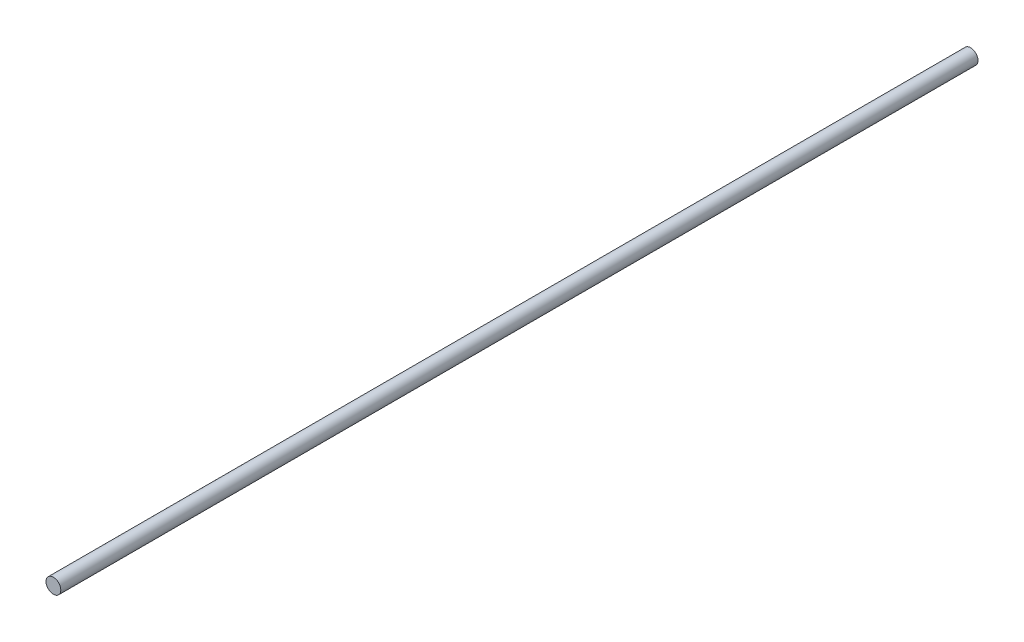
ISO-10303-21;
HEADER;
FILE_DESCRIPTION(('STEP AP214'),'2;1');
FILE_NAME('part.step','',(''),(''),'','','');
FILE_SCHEMA(('AUTOMOTIVE_DESIGN { 1 0 10303 214 1 1 1 1 }'));
ENDSEC;
DATA;
#1=APPLICATION_CONTEXT('core data for automotive mechanical design processes');
#2=APPLICATION_PROTOCOL_DEFINITION('international standard','automotive_design',2000,#1);
#3=PRODUCT_CONTEXT('',#1,'mechanical');
#4=PRODUCT('Part','Part','',(#3));
#5=PRODUCT_RELATED_PRODUCT_CATEGORY('part','',(#4));
#6=PRODUCT_DEFINITION_FORMATION('','',#4);
#7=PRODUCT_DEFINITION_CONTEXT('part definition',#1,'design');
#8=PRODUCT_DEFINITION('design','',#6,#7);
#9=PRODUCT_DEFINITION_SHAPE('','',#8);
#10=(LENGTH_UNIT() NAMED_UNIT(*) SI_UNIT(.MILLI.,.METRE.));
#11=(NAMED_UNIT(*) PLANE_ANGLE_UNIT() SI_UNIT($,.RADIAN.));
#12=(NAMED_UNIT(*) SI_UNIT($,.STERADIAN.) SOLID_ANGLE_UNIT());
#13=UNCERTAINTY_MEASURE_WITH_UNIT(LENGTH_MEASURE(1.E-05),#10,'distance_accuracy_value','');
#14=(GEOMETRIC_REPRESENTATION_CONTEXT(3) GLOBAL_UNCERTAINTY_ASSIGNED_CONTEXT((#13)) GLOBAL_UNIT_ASSIGNED_CONTEXT((#10,
#11,#12)) REPRESENTATION_CONTEXT('',''));
#15=CARTESIAN_POINT('',(0.,0.,0.));
#16=DIRECTION('',(0.,0.,1.));
#17=DIRECTION('',(1.,0.,0.));
#18=AXIS2_PLACEMENT_3D('',#15,#16,#17);
#19=CARTESIAN_POINT('',(0.,0.,620.));
#20=DIRECTION('',(0.,0.,-1.));
#21=DIRECTION('',(-1.,0.,0.));
#22=AXIS2_PLACEMENT_3D('',#19,#20,#21);
#23=CYLINDRICAL_SURFACE('',#22,5.);
#24=CARTESIAN_POINT('',(0.,0.,620.));
#25=DIRECTION('',(0.,0.,1.));
#26=DIRECTION('',(1.,0.,0.));
#27=AXIS2_PLACEMENT_3D('',#24,#25,#26);
#28=CIRCLE('',#27,5.);
#29=CARTESIAN_POINT('',(5.,0.,620.));
#30=VERTEX_POINT('',#29);
#31=EDGE_CURVE('E10',#30,#30,#28,.T.);
#32=ORIENTED_EDGE('',*,*,#31,.F.);
#33=EDGE_LOOP('',(#32));
#34=FACE_BOUND('',#33,.T.);
#35=CARTESIAN_POINT('',(0.,0.,0.));
#36=DIRECTION('',(0.,0.,1.));
#37=DIRECTION('',(1.,0.,0.));
#38=AXIS2_PLACEMENT_3D('',#35,#36,#37);
#39=CIRCLE('',#38,5.);
#40=CARTESIAN_POINT('',(5.,0.,0.));
#41=VERTEX_POINT('',#40);
#42=EDGE_CURVE('E18',#41,#41,#39,.T.);
#43=ORIENTED_EDGE('',*,*,#42,.T.);
#44=EDGE_LOOP('',(#43));
#45=FACE_BOUND('',#44,.T.);
#46=ADVANCED_FACE('F15',(#34,#45),#23,.T.);
#47=CARTESIAN_POINT('',(0.,0.,620.));
#48=DIRECTION('',(0.,0.,1.));
#49=DIRECTION('',(1.,0.,0.));
#50=AXIS2_PLACEMENT_3D('',#47,#48,#49);
#51=PLANE('',#50);
#52=ORIENTED_EDGE('',*,*,#31,.T.);
#53=EDGE_LOOP('',(#52));
#54=FACE_BOUND('',#53,.T.);
#55=ADVANCED_FACE('F30',(#54),#51,.T.);
#56=CARTESIAN_POINT('',(0.,0.,0.));
#57=DIRECTION('',(0.,0.,1.));
#58=DIRECTION('',(1.,0.,0.));
#59=AXIS2_PLACEMENT_3D('',#56,#57,#58);
#60=PLANE('',#59);
#61=ORIENTED_EDGE('',*,*,#42,.F.);
#62=EDGE_LOOP('',(#61));
#63=FACE_BOUND('',#62,.T.);
#64=ADVANCED_FACE('F28',(#63),#60,.F.);
#65=CLOSED_SHELL('',(#46,#55,#64));
#66=MANIFOLD_SOLID_BREP('B1',#65);
#67=ADVANCED_BREP_SHAPE_REPRESENTATION('',(#18,#66),#14);
#68=SHAPE_DEFINITION_REPRESENTATION(#9,#67);
ENDSEC;
END-ISO-10303-21;
